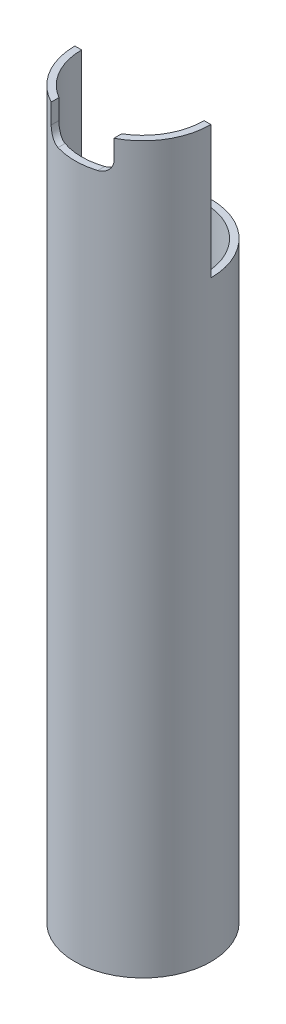
ISO-10303-21;
HEADER;
FILE_DESCRIPTION(('STEP AP214'),'2;1');
FILE_NAME('part.step','',(''),(''),'','','');
FILE_SCHEMA(('AUTOMOTIVE_DESIGN { 1 0 10303 214 1 1 1 1 }'));
ENDSEC;
DATA;
#1=APPLICATION_CONTEXT('core data for automotive mechanical design processes');
#2=APPLICATION_PROTOCOL_DEFINITION('international standard','automotive_design',2000,#1);
#3=PRODUCT_CONTEXT('',#1,'mechanical');
#4=PRODUCT('Part','Part','',(#3));
#5=PRODUCT_RELATED_PRODUCT_CATEGORY('part','',(#4));
#6=PRODUCT_DEFINITION_FORMATION('','',#4);
#7=PRODUCT_DEFINITION_CONTEXT('part definition',#1,'design');
#8=PRODUCT_DEFINITION('design','',#6,#7);
#9=PRODUCT_DEFINITION_SHAPE('','',#8);
#10=(LENGTH_UNIT() NAMED_UNIT(*) SI_UNIT(.MILLI.,.METRE.));
#11=(NAMED_UNIT(*) PLANE_ANGLE_UNIT() SI_UNIT($,.RADIAN.));
#12=(NAMED_UNIT(*) SI_UNIT($,.STERADIAN.) SOLID_ANGLE_UNIT());
#13=UNCERTAINTY_MEASURE_WITH_UNIT(LENGTH_MEASURE(1.E-05),#10,'distance_accuracy_value','');
#14=(GEOMETRIC_REPRESENTATION_CONTEXT(3) GLOBAL_UNCERTAINTY_ASSIGNED_CONTEXT((#13)) GLOBAL_UNIT_ASSIGNED_CONTEXT((#10,
#11,#12)) REPRESENTATION_CONTEXT('',''));
#15=CARTESIAN_POINT('',(0.,0.,0.));
#16=DIRECTION('',(0.,0.,1.));
#17=DIRECTION('',(1.,0.,0.));
#18=AXIS2_PLACEMENT_3D('',#15,#16,#17);
#19=CARTESIAN_POINT('',(0.,152.5,0.));
#20=DIRECTION('',(0.,1.,0.));
#21=DIRECTION('',(0.,0.,1.));
#22=AXIS2_PLACEMENT_3D('',#19,#20,#21);
#23=PLANE('',#22);
#24=DIRECTION('',(0.,0.,-1.));
#25=VECTOR('',#24,1.);
#26=CARTESIAN_POINT('',(6.5,152.5,14.5));
#27=LINE('',#26,#25);
#28=CARTESIAN_POINT('',(6.5,152.5,12.5095765815634));
#29=VERTEX_POINT('',#28);
#30=CARTESIAN_POINT('',(6.5,152.5,10.9105453575887));
#31=VERTEX_POINT('',#30);
#32=EDGE_CURVE('E118',#29,#31,#27,.T.);
#33=ORIENTED_EDGE('',*,*,#32,.F.);
#34=CARTESIAN_POINT('',(0.,152.5,0.));
#35=DIRECTION('',(0.,1.,0.));
#36=DIRECTION('',(0.,0.,1.));
#37=AXIS2_PLACEMENT_3D('',#34,#35,#36);
#38=CIRCLE('',#37,14.0975);
#39=CARTESIAN_POINT('',(14.0975,152.5,0.));
#40=VERTEX_POINT('',#39);
#41=EDGE_CURVE('E130',#29,#40,#38,.T.);
#42=ORIENTED_EDGE('',*,*,#41,.T.);
#43=DIRECTION('',(1.,0.,0.));
#44=VECTOR('',#43,1.);
#45=CARTESIAN_POINT('',(-14.0975,152.5,0.));
#46=LINE('',#45,#44);
#47=CARTESIAN_POINT('',(12.7,152.5,0.));
#48=VERTEX_POINT('',#47);
#49=EDGE_CURVE('E124',#48,#40,#46,.T.);
#50=ORIENTED_EDGE('',*,*,#49,.F.);
#51=CARTESIAN_POINT('',(0.,152.5,0.));
#52=DIRECTION('',(0.,1.,0.));
#53=DIRECTION('',(0.,0.,1.));
#54=AXIS2_PLACEMENT_3D('',#51,#52,#53);
#55=CIRCLE('',#54,12.7);
#56=EDGE_CURVE('E132',#31,#48,#55,.T.);
#57=ORIENTED_EDGE('',*,*,#56,.F.);
#58=EDGE_LOOP('',(#33,#42,#50,#57));
#59=FACE_BOUND('',#58,.T.);
#60=ADVANCED_FACE('F38',(#59),#23,.T.);
#61=DIRECTION('',(0.,0.,1.));
#62=VECTOR('',#61,1.);
#63=CARTESIAN_POINT('',(-6.5,152.5,9.24682981584995));
#64=LINE('',#63,#62);
#65=CARTESIAN_POINT('',(-6.5,152.5,10.9105453575887));
#66=VERTEX_POINT('',#65);
#67=CARTESIAN_POINT('',(-6.5,152.5,12.5095765815634));
#68=VERTEX_POINT('',#67);
#69=EDGE_CURVE('E133',#66,#68,#64,.T.);
#70=ORIENTED_EDGE('',*,*,#69,.F.);
#71=CARTESIAN_POINT('',(-12.7,152.5,0.));
#72=VERTEX_POINT('',#71);
#73=EDGE_CURVE('E141',#72,#66,#55,.T.);
#74=ORIENTED_EDGE('',*,*,#73,.F.);
#75=CARTESIAN_POINT('',(-14.0975,152.5,0.));
#76=VERTEX_POINT('',#75);
#77=EDGE_CURVE('E326',#76,#72,#46,.T.);
#78=ORIENTED_EDGE('',*,*,#77,.F.);
#79=EDGE_CURVE('E140',#76,#68,#38,.T.);
#80=ORIENTED_EDGE('',*,*,#79,.T.);
#81=EDGE_LOOP('',(#70,#74,#78,#80));
#82=FACE_BOUND('',#81,.T.);
#83=ADVANCED_FACE('F193',(#82),#23,.T.);
#84=CARTESIAN_POINT('',(0.,152.5,0.));
#85=DIRECTION('',(0.,-1.,0.));
#86=DIRECTION('',(0.,0.,-1.));
#87=AXIS2_PLACEMENT_3D('',#84,#85,#86);
#88=CYLINDRICAL_SURFACE('',#87,14.0975);
#89=CARTESIAN_POINT('',(0.,2.25,0.));
#90=DIRECTION('',(0.,1.,0.));
#91=DIRECTION('',(0.,0.,1.));
#92=AXIS2_PLACEMENT_3D('',#89,#90,#91);
#93=CIRCLE('',#92,14.0975);
#94=CARTESIAN_POINT('',(0.,2.25,14.0975));
#95=VERTEX_POINT('',#94);
#96=EDGE_CURVE('E134',#95,#95,#93,.T.);
#97=ORIENTED_EDGE('',*,*,#96,.T.);
#98=EDGE_LOOP('',(#97));
#99=FACE_BOUND('',#98,.T.);
#100=ORIENTED_EDGE('',*,*,#41,.F.);
#101=DIRECTION('',(0.,-1.,0.));
#102=VECTOR('',#101,1.);
#103=CARTESIAN_POINT('',(6.5,152.5,12.5095765815634));
#104=LINE('',#103,#102);
#105=CARTESIAN_POINT('',(6.5,148.38,12.5095765815634));
#106=VERTEX_POINT('',#105);
#107=EDGE_CURVE('E114',#29,#106,#104,.T.);
#108=ORIENTED_EDGE('',*,*,#107,.T.);
#109=CARTESIAN_POINT('',(6.5,148.38,12.5095765815634));
#110=CARTESIAN_POINT('',(6.50001009768532,148.317870582901,12.5095676157561));
#111=CARTESIAN_POINT('',(6.49756745840708,148.255747793033,12.5108404474495));
#112=CARTESIAN_POINT('',(6.48785475137029,148.132004895739,12.5158819716807));
#113=CARTESIAN_POINT('',(6.48058645726819,148.070384612039,12.5196497472072));
#114=CARTESIAN_POINT('',(6.4613416872934,147.948351752285,12.5295921766398));
#115=CARTESIAN_POINT('',(6.44938551255921,147.887935133607,12.5357564514063));
#116=CARTESIAN_POINT('',(6.42091702848224,147.768480533861,12.5503619710676));
#117=CARTESIAN_POINT('',(6.40440447344429,147.709442627323,12.5588033387502));
#118=CARTESIAN_POINT('',(6.34832580909172,147.535123129009,12.5872967714154));
#119=CARTESIAN_POINT('',(6.30218014659227,147.422396034739,12.6105385541581));
#120=CARTESIAN_POINT('',(6.19413871822813,147.206559667615,12.6639553040812));
#121=CARTESIAN_POINT('',(6.13222857364848,147.103459293212,12.694136598308));
#122=CARTESIAN_POINT('',(5.99078271491314,146.903385072729,12.76152364721));
#123=CARTESIAN_POINT('',(5.91045986638343,146.807068193437,12.799026161601));
#124=CARTESIAN_POINT('',(5.73668892030619,146.62893764884,12.8778496253));
#125=CARTESIAN_POINT('',(5.64323536941319,146.547130041517,12.9191721586582));
#126=CARTESIAN_POINT('',(5.4354708684361,146.391941064971,13.0080414020841));
#127=CARTESIAN_POINT('',(5.32000901367429,146.320216988342,13.0557975842956));
#128=CARTESIAN_POINT('',(5.07869839158688,146.197427257401,13.1515469838148));
#129=CARTESIAN_POINT('',(4.95285141701944,146.146358046433,13.1995401588718));
#130=CARTESIAN_POINT('',(4.71024316315184,146.071318527466,13.2878711403678));
#131=CARTESIAN_POINT('',(4.59435883536814,146.044729706664,13.3284068887391));
#132=CARTESIAN_POINT('',(4.35918364489443,146.009055558971,13.4071892712809));
#133=CARTESIAN_POINT('',(4.23989290121461,145.999969621339,13.4454359852793));
#134=CARTESIAN_POINT('',(4.12,146.,13.4820290108722));
#135=B_SPLINE_CURVE_WITH_KNOTS('',3,(#109,#110,#111,#112,#113,#114,#115,#116,#117,#118,#119,
#120,#121,#122,#123,#124,#125,#126,#127,#128,#129,#130,#131,#132,#133,#134),.UNSPECIFIED.,.F.,
.F.,(4,2,2,2,2,2,2,2,2,2,2,2,4),(0.,0.186316167403782,0.372563892683267,0.558013814879485,
0.743473739107301,1.11367187593743,1.48420888596078,1.87529740180559,2.26654882437739,
2.69687158394826,3.1271202127177,3.50270754482531,3.87828177102743),.UNSPECIFIED.);
#136=CARTESIAN_POINT('',(4.12,146.,13.4820290108722));
#137=VERTEX_POINT('',#136);
#138=EDGE_CURVE('E177',#106,#137,#135,.T.);
#139=ORIENTED_EDGE('',*,*,#138,.T.);
#140=CARTESIAN_POINT('',(0.,146.,0.));
#141=DIRECTION('',(0.,1.,0.));
#142=DIRECTION('',(0.,0.,1.));
#143=AXIS2_PLACEMENT_3D('',#140,#141,#142);
#144=CIRCLE('',#143,14.0975);
#145=CARTESIAN_POINT('',(-4.12,146.,13.4820290108722));
#146=VERTEX_POINT('',#145);
#147=EDGE_CURVE('E318',#146,#137,#144,.T.);
#148=ORIENTED_EDGE('',*,*,#147,.F.);
#149=CARTESIAN_POINT('',(-4.12,146.,13.4820290108722));
#150=CARTESIAN_POINT('',(-4.19098474362919,146.000001630097,13.4603401242525));
#151=CARTESIAN_POINT('',(-4.26175550893282,146.003176986293,13.43809598906));
#152=CARTESIAN_POINT('',(-4.40241862042576,146.015760231356,13.3926720145503));
#153=CARTESIAN_POINT('',(-4.4723111852089,146.025166536649,13.3694924143834));
#154=CARTESIAN_POINT('',(-4.67977880225313,146.062513170882,13.2988878603086));
#155=CARTESIAN_POINT('',(-4.81542541699703,146.099582165899,13.2503108008415));
#156=CARTESIAN_POINT('',(-5.07762542996818,146.196672448058,13.1520673096199));
#157=CARTESIAN_POINT('',(-5.20418322810617,146.256682539188,13.1024014203781));
#158=CARTESIAN_POINT('',(-5.44522148559835,146.398153769546,13.0040767843277));
#159=CARTESIAN_POINT('',(-5.55969765330369,146.479622495648,12.9554184003068));
#160=CARTESIAN_POINT('',(-5.77472690232289,146.663453443958,12.8610268930136));
#161=CARTESIAN_POINT('',(-5.87508713022025,146.766065147209,12.815338167405));
#162=CARTESIAN_POINT('',(-6.05677869013967,146.98931727874,12.730475640323));
#163=CARTESIAN_POINT('',(-6.138113214441,147.109954676955,12.6913007462283));
#164=CARTESIAN_POINT('',(-6.27414457859427,147.358769404756,12.6245815549173));
#165=CARTESIAN_POINT('',(-6.33012804960091,147.486084322373,12.5964881880794));
#166=CARTESIAN_POINT('',(-6.39701080842967,147.683948742198,12.56257810345));
#167=CARTESIAN_POINT('',(-6.41645162227142,147.751021857872,12.5526489096419));
#168=CARTESIAN_POINT('',(-6.44941808495981,147.886957882047,12.5357432603606));
#169=CARTESIAN_POINT('',(-6.46294708900643,147.955819751781,12.5287651301077));
#170=CARTESIAN_POINT('',(-6.48224741726817,148.083857821893,12.5187889666242));
#171=CARTESIAN_POINT('',(-6.48889990962685,148.14286845675,12.5153397499963));
#172=CARTESIAN_POINT('',(-6.49777766266929,148.261249525318,12.5107312695137));
#173=CARTESIAN_POINT('',(-6.50000742175652,148.320619531776,12.5095696789016));
#174=CARTESIAN_POINT('',(-6.5,148.38,12.5095765815634));
#175=B_SPLINE_CURVE_WITH_KNOTS('',3,(#149,#150,#151,#152,#153,#154,#155,#156,#157,#158,#159,
#160,#161,#162,#163,#164,#165,#166,#167,#168,#169,#170,#171,#172,#173,#174),.UNSPECIFIED.,.F.,
.F.,(4,2,2,2,2,2,2,2,2,2,2,2,4),(0.,0.222522638362844,0.444988745086888,0.889048669323842,
1.3328921537457,1.77689277376118,2.22646793825014,2.67596761535688,3.09899602831486,
3.31032830259547,3.52154048067487,3.69979089919715,3.8778599243901),.UNSPECIFIED.);
#176=CARTESIAN_POINT('',(-6.5,148.38,12.5095765815634));
#177=VERTEX_POINT('',#176);
#178=EDGE_CURVE('E48',#146,#177,#175,.T.);
#179=ORIENTED_EDGE('',*,*,#178,.T.);
#180=DIRECTION('',(0.,-1.,0.));
#181=VECTOR('',#180,1.);
#182=CARTESIAN_POINT('',(-6.5,152.5,12.5095765815634));
#183=LINE('',#182,#181);
#184=EDGE_CURVE('E125',#177,#68,#183,.F.);
#185=ORIENTED_EDGE('',*,*,#184,.T.);
#186=ORIENTED_EDGE('',*,*,#79,.F.);
#187=DIRECTION('',(0.,1.,0.));
#188=VECTOR('',#187,1.);
#189=CARTESIAN_POINT('',(-14.0975,125.,0.));
#190=LINE('',#189,#188);
#191=CARTESIAN_POINT('',(-14.0975,125.,0.));
#192=VERTEX_POINT('',#191);
#193=EDGE_CURVE('E324',#192,#76,#190,.T.);
#194=ORIENTED_EDGE('',*,*,#193,.F.);
#195=CARTESIAN_POINT('',(0.,125.,0.));
#196=DIRECTION('',(0.,-1.,0.));
#197=DIRECTION('',(0.,0.,-1.));
#198=AXIS2_PLACEMENT_3D('',#195,#196,#197);
#199=CIRCLE('',#198,14.0975);
#200=CARTESIAN_POINT('',(14.0975,125.,0.));
#201=VERTEX_POINT('',#200);
#202=EDGE_CURVE('E329',#192,#201,#199,.T.);
#203=ORIENTED_EDGE('',*,*,#202,.T.);
#204=DIRECTION('',(0.,-1.,0.));
#205=VECTOR('',#204,1.);
#206=CARTESIAN_POINT('',(14.0975,152.5,0.));
#207=LINE('',#206,#205);
#208=EDGE_CURVE('E139',#201,#40,#207,.F.);
#209=ORIENTED_EDGE('',*,*,#208,.T.);
#210=EDGE_LOOP('',(#100,#108,#139,#148,#179,#185,#186,#194,#203,#209));
#211=FACE_BOUND('',#210,.T.);
#212=ADVANCED_FACE('F137',(#99,#211),#88,.T.);
#213=CARTESIAN_POINT('',(0.,152.5,0.));
#214=DIRECTION('',(0.,-1.,0.));
#215=DIRECTION('',(0.,0.,-1.));
#216=AXIS2_PLACEMENT_3D('',#213,#214,#215);
#217=CYLINDRICAL_SURFACE('',#216,12.7);
#218=CARTESIAN_POINT('',(0.,2.25,0.));
#219=DIRECTION('',(0.,1.,0.));
#220=DIRECTION('',(0.,0.,1.));
#221=AXIS2_PLACEMENT_3D('',#218,#219,#220);
#222=CIRCLE('',#221,12.7);
#223=CARTESIAN_POINT('',(0.,2.25,12.7));
#224=VERTEX_POINT('',#223);
#225=EDGE_CURVE('E43',#224,#224,#222,.T.);
#226=ORIENTED_EDGE('',*,*,#225,.F.);
#227=EDGE_LOOP('',(#226));
#228=FACE_BOUND('',#227,.T.);
#229=DIRECTION('',(0.,-1.,0.));
#230=VECTOR('',#229,1.);
#231=CARTESIAN_POINT('',(6.5,152.5,10.9105453575887));
#232=LINE('',#231,#230);
#233=CARTESIAN_POINT('',(6.5,148.38,10.9105453575887));
#234=VERTEX_POINT('',#233);
#235=EDGE_CURVE('E161',#31,#234,#232,.T.);
#236=ORIENTED_EDGE('',*,*,#235,.F.);
#237=ORIENTED_EDGE('',*,*,#56,.T.);
#238=DIRECTION('',(0.,-1.,0.));
#239=VECTOR('',#238,1.);
#240=CARTESIAN_POINT('',(12.7,152.5,0.));
#241=LINE('',#240,#239);
#242=CARTESIAN_POINT('',(12.7,125.,0.));
#243=VERTEX_POINT('',#242);
#244=EDGE_CURVE('E150',#243,#48,#241,.F.);
#245=ORIENTED_EDGE('',*,*,#244,.F.);
#246=CARTESIAN_POINT('',(0.,125.,0.));
#247=DIRECTION('',(0.,-1.,0.));
#248=DIRECTION('',(0.,0.,-1.));
#249=AXIS2_PLACEMENT_3D('',#246,#247,#248);
#250=CIRCLE('',#249,12.7);
#251=CARTESIAN_POINT('',(-12.7,125.,0.));
#252=VERTEX_POINT('',#251);
#253=EDGE_CURVE('E144',#252,#243,#250,.T.);
#254=ORIENTED_EDGE('',*,*,#253,.F.);
#255=DIRECTION('',(0.,-1.,0.));
#256=VECTOR('',#255,1.);
#257=CARTESIAN_POINT('',(-12.7,152.5,0.));
#258=LINE('',#257,#256);
#259=EDGE_CURVE('E153',#72,#252,#258,.T.);
#260=ORIENTED_EDGE('',*,*,#259,.F.);
#261=ORIENTED_EDGE('',*,*,#73,.T.);
#262=DIRECTION('',(0.,-1.,0.));
#263=VECTOR('',#262,1.);
#264=CARTESIAN_POINT('',(-6.5,152.5,10.9105453575887));
#265=LINE('',#264,#263);
#266=CARTESIAN_POINT('',(-6.5,148.38,10.9105453575887));
#267=VERTEX_POINT('',#266);
#268=EDGE_CURVE('E159',#267,#66,#265,.F.);
#269=ORIENTED_EDGE('',*,*,#268,.F.);
#270=CARTESIAN_POINT('',(-6.5,148.38,10.9105453575887));
#271=CARTESIAN_POINT('',(-6.50001088735296,148.319043760554,10.9105346732622));
#272=CARTESIAN_POINT('',(-6.49765852130349,148.258095159801,10.9119402075039));
#273=CARTESIAN_POINT('',(-6.48831152221107,148.136708510344,10.9175028005306));
#274=CARTESIAN_POINT('',(-6.48131901454447,148.076270240716,10.9216585995785));
#275=CARTESIAN_POINT('',(-6.46282323225552,147.956649437679,10.9326128722715));
#276=CARTESIAN_POINT('',(-6.45134320193654,147.897462064,10.9393977264795));
#277=CARTESIAN_POINT('',(-6.42403198127844,147.780458035256,10.9554581510253));
#278=CARTESIAN_POINT('',(-6.40820047191953,147.722641481028,10.9647339039771));
#279=CARTESIAN_POINT('',(-6.35450011048327,147.552002144147,10.9960018571569));
#280=CARTESIAN_POINT('',(-6.31038023962045,147.441704151166,11.0214621501823));
#281=CARTESIAN_POINT('',(-6.20728053204836,147.23042170825,11.0798538459556));
#282=CARTESIAN_POINT('',(-6.14828340259125,147.129448284732,11.1127939384667));
#283=CARTESIAN_POINT('',(-6.0128695401625,146.931992768285,11.1866765249768));
#284=CARTESIAN_POINT('',(-5.93554048289315,146.836284139853,11.2280110899305));
#285=CARTESIAN_POINT('',(-5.76827539690865,146.658814702578,11.3148523905307));
#286=CARTESIAN_POINT('',(-5.67833389438963,146.577059984074,11.3603609347027));
#287=CARTESIAN_POINT('',(-5.47572761633155,146.419155008177,11.4595226262541));
#288=CARTESIAN_POINT('',(-5.36162762858543,146.345029158018,11.5134769036124));
#289=CARTESIAN_POINT('',(-5.12268643174607,146.217274520086,11.6217593971051));
#290=CARTESIAN_POINT('',(-4.99784596107197,146.163644324593,11.6760875872967));
#291=CARTESIAN_POINT('',(-4.74933591680528,146.081258862228,11.7792433134654));
#292=CARTESIAN_POINT('',(-4.62621539059357,146.051004849001,11.828187143887));
#293=CARTESIAN_POINT('',(-4.43835400541163,146.020532260752,11.8993919079599));
#294=CARTESIAN_POINT('',(-4.37517174504096,146.012859370079,11.9227692305159));
#295=CARTESIAN_POINT('',(-4.24806205454295,146.002593037803,11.968648451232));
#296=CARTESIAN_POINT('',(-4.1841344233686,146.000001000095,11.9911501057527));
#297=CARTESIAN_POINT('',(-4.12,146.,12.0131428027806));
#298=B_SPLINE_CURVE_WITH_KNOTS('',3,(#270,#271,#272,#273,#274,#275,#276,#277,#278,#279,#280,
#281,#282,#283,#284,#285,#286,#287,#288,#289,#290,#291,#292,#293,#294,#295,#296,#297),
.UNSPECIFIED.,.F.,.F.,(4,2,2,2,2,2,2,2,2,2,2,2,2,4),(0.,0.182794514069929,0.36550535844777,
0.547282084081665,0.729072139860438,1.09179218924702,1.45493580955165,1.84279616195918,
2.23082536983475,2.66804621378961,3.10523702235064,3.51131185337635,3.71454828246224,
3.91784086006427),.UNSPECIFIED.);
#299=CARTESIAN_POINT('',(-4.12,146.,12.0131428027806));
#300=VERTEX_POINT('',#299);
#301=EDGE_CURVE('E11',#267,#300,#298,.T.);
#302=ORIENTED_EDGE('',*,*,#301,.T.);
#303=CARTESIAN_POINT('',(0.,146.,0.));
#304=DIRECTION('',(0.,1.,0.));
#305=DIRECTION('',(0.,0.,1.));
#306=AXIS2_PLACEMENT_3D('',#303,#304,#305);
#307=CIRCLE('',#306,12.7);
#308=CARTESIAN_POINT('',(4.12,146.,12.0131428027806));
#309=VERTEX_POINT('',#308);
#310=EDGE_CURVE('E156',#300,#309,#307,.T.);
#311=ORIENTED_EDGE('',*,*,#310,.T.);
#312=CARTESIAN_POINT('',(4.12,146.,12.0131428027806));
#313=CARTESIAN_POINT('',(4.19200650797641,146.000001992391,11.9884517381874));
#314=CARTESIAN_POINT('',(4.26374526629335,146.003268899882,11.9631198948691));
#315=CARTESIAN_POINT('',(4.40622742887299,146.016190679507,11.9113764029583));
#316=CARTESIAN_POINT('',(4.47697113811723,146.02584354877,11.8849650953613));
#317=CARTESIAN_POINT('',(4.68678595808487,146.064116475585,11.8045063311336));
#318=CARTESIAN_POINT('',(4.82375494147644,146.102052132617,11.7491259098461));
#319=CARTESIAN_POINT('',(5.08815201578518,146.201230792339,11.637068744069));
#320=CARTESIAN_POINT('',(5.21558732337438,146.2624559476,11.5803930233876));
#321=CARTESIAN_POINT('',(5.45810497472878,146.406732175295,11.468083991914));
#322=CARTESIAN_POINT('',(5.5731802981534,146.48979556024,11.4124512881965));
#323=CARTESIAN_POINT('',(5.7897028299144,146.677822626916,11.304170203067));
#324=CARTESIAN_POINT('',(5.89087351361473,146.783147122716,11.2515918649023));
#325=CARTESIAN_POINT('',(6.07358437972288,147.012731860152,11.1540267899921));
#326=CARTESIAN_POINT('',(6.15513036367859,147.136986487791,11.109037810823));
#327=CARTESIAN_POINT('',(6.28951469812377,147.391714805662,11.0334741496124));
#328=CARTESIAN_POINT('',(6.34403852592874,147.521036488304,11.0020756009466));
#329=CARTESIAN_POINT('',(6.40834223266653,147.722080424258,10.9646590764695));
#330=CARTESIAN_POINT('',(6.42685678868543,147.790225586174,10.9538043520165));
#331=CARTESIAN_POINT('',(6.45781509846172,147.928322024726,10.9355818970137));
#332=CARTESIAN_POINT('',(6.47026300175169,147.998272032285,10.9282117831269));
#333=CARTESIAN_POINT('',(6.4863560412479,148.120268785242,10.9186651337176));
#334=CARTESIAN_POINT('',(6.49146929522417,148.172061236432,10.9156242999898));
#335=CARTESIAN_POINT('',(6.49829187478314,148.275898987933,10.9115629848687));
#336=CARTESIAN_POINT('',(6.50000441333593,148.327944002963,10.9105405964688));
#337=CARTESIAN_POINT('',(6.5,148.38,10.9105453575887));
#338=B_SPLINE_CURVE_WITH_KNOTS('',3,(#312,#313,#314,#315,#316,#317,#318,#319,#320,#321,#322,
#323,#324,#325,#326,#327,#328,#329,#330,#331,#332,#333,#334,#335,#336,#337),.UNSPECIFIED.,.F.,
.F.,(4,2,2,2,2,2,2,2,2,2,2,2,4),(0.,0.228208752075058,0.456345963423635,0.911636564751323,
1.36657896406082,1.82177841439823,2.28501573347573,2.74811593942735,3.17673309897565,
3.39076479888318,3.60464989697072,3.76090660953327,3.91701562156823),.UNSPECIFIED.);
#339=EDGE_CURVE('E171',#309,#234,#338,.T.);
#340=ORIENTED_EDGE('',*,*,#339,.T.);
#341=EDGE_LOOP('',(#236,#237,#245,#254,#260,#261,#269,#302,#311,#340));
#342=FACE_BOUND('',#341,.T.);
#343=ADVANCED_FACE('F185',(#228,#342),#217,.F.);
#344=CARTESIAN_POINT('',(-14.0975,125.,0.));
#345=DIRECTION('',(0.,0.,1.));
#346=DIRECTION('',(1.,0.,0.));
#347=AXIS2_PLACEMENT_3D('',#344,#345,#346);
#348=PLANE('',#347);
#349=DIRECTION('',(1.,0.,0.));
#350=VECTOR('',#349,1.);
#351=CARTESIAN_POINT('',(-14.0975,125.,0.));
#352=LINE('',#351,#350);
#353=EDGE_CURVE('E325',#243,#201,#352,.T.);
#354=ORIENTED_EDGE('',*,*,#353,.F.);
#355=ORIENTED_EDGE('',*,*,#244,.T.);
#356=ORIENTED_EDGE('',*,*,#49,.T.);
#357=ORIENTED_EDGE('',*,*,#208,.F.);
#358=EDGE_LOOP('',(#354,#355,#356,#357));
#359=FACE_BOUND('',#358,.T.);
#360=ADVANCED_FACE('F190',(#359),#348,.F.);
#361=ORIENTED_EDGE('',*,*,#259,.T.);
#362=EDGE_CURVE('E322',#192,#252,#352,.T.);
#363=ORIENTED_EDGE('',*,*,#362,.F.);
#364=ORIENTED_EDGE('',*,*,#193,.T.);
#365=ORIENTED_EDGE('',*,*,#77,.T.);
#366=EDGE_LOOP('',(#361,#363,#364,#365));
#367=FACE_BOUND('',#366,.T.);
#368=ADVANCED_FACE('F238',(#367),#348,.F.);
#369=CARTESIAN_POINT('',(0.,125.,0.));
#370=DIRECTION('',(0.,-1.,0.));
#371=DIRECTION('',(0.,0.,-1.));
#372=AXIS2_PLACEMENT_3D('',#369,#370,#371);
#373=PLANE('',#372);
#374=ORIENTED_EDGE('',*,*,#362,.T.);
#375=ORIENTED_EDGE('',*,*,#253,.T.);
#376=ORIENTED_EDGE('',*,*,#353,.T.);
#377=ORIENTED_EDGE('',*,*,#202,.F.);
#378=EDGE_LOOP('',(#374,#375,#376,#377));
#379=FACE_BOUND('',#378,.T.);
#380=ADVANCED_FACE('F244',(#379),#373,.F.);
#381=CARTESIAN_POINT('',(6.5,146.,14.5));
#382=DIRECTION('',(1.,0.,0.));
#383=DIRECTION('',(0.,0.,-1.));
#384=AXIS2_PLACEMENT_3D('',#381,#382,#383);
#385=PLANE('',#384);
#386=ORIENTED_EDGE('',*,*,#235,.T.);
#387=DIRECTION('',(0.,0.,-1.));
#388=VECTOR('',#387,1.);
#389=CARTESIAN_POINT('',(6.5,148.38,14.5));
#390=LINE('',#389,#388);
#391=EDGE_CURVE('E121',#234,#106,#390,.F.);
#392=ORIENTED_EDGE('',*,*,#391,.T.);
#393=ORIENTED_EDGE('',*,*,#107,.F.);
#394=ORIENTED_EDGE('',*,*,#32,.T.);
#395=EDGE_LOOP('',(#386,#392,#393,#394));
#396=FACE_BOUND('',#395,.T.);
#397=ADVANCED_FACE('F117',(#396),#385,.F.);
#398=CARTESIAN_POINT('',(-6.5,146.,9.24682981584995));
#399=DIRECTION('',(-1.,0.,0.));
#400=DIRECTION('',(0.,0.,1.));
#401=AXIS2_PLACEMENT_3D('',#398,#399,#400);
#402=PLANE('',#401);
#403=ORIENTED_EDGE('',*,*,#184,.F.);
#404=DIRECTION('',(0.,0.,1.));
#405=VECTOR('',#404,1.);
#406=CARTESIAN_POINT('',(-6.5,148.38,9.24682981584995));
#407=LINE('',#406,#405);
#408=EDGE_CURVE('E61',#177,#267,#407,.F.);
#409=ORIENTED_EDGE('',*,*,#408,.T.);
#410=ORIENTED_EDGE('',*,*,#268,.T.);
#411=ORIENTED_EDGE('',*,*,#69,.T.);
#412=EDGE_LOOP('',(#403,#409,#410,#411));
#413=FACE_BOUND('',#412,.T.);
#414=ADVANCED_FACE('F255',(#413),#402,.F.);
#415=CARTESIAN_POINT('',(0.,146.,0.));
#416=DIRECTION('',(0.,1.,0.));
#417=DIRECTION('',(0.,0.,1.));
#418=AXIS2_PLACEMENT_3D('',#415,#416,#417);
#419=PLANE('',#418);
#420=ORIENTED_EDGE('',*,*,#147,.T.);
#421=DIRECTION('',(0.,0.,-1.));
#422=VECTOR('',#421,1.);
#423=CARTESIAN_POINT('',(4.12,146.,0.));
#424=LINE('',#423,#422);
#425=EDGE_CURVE('E166',#137,#309,#424,.T.);
#426=ORIENTED_EDGE('',*,*,#425,.T.);
#427=ORIENTED_EDGE('',*,*,#310,.F.);
#428=DIRECTION('',(0.,0.,1.));
#429=VECTOR('',#428,1.);
#430=CARTESIAN_POINT('',(-4.12,146.,0.));
#431=LINE('',#430,#429);
#432=EDGE_CURVE('E163',#300,#146,#431,.T.);
#433=ORIENTED_EDGE('',*,*,#432,.T.);
#434=EDGE_LOOP('',(#420,#426,#427,#433));
#435=FACE_BOUND('',#434,.T.);
#436=ADVANCED_FACE('F262',(#435),#419,.T.);
#437=CARTESIAN_POINT('',(4.12,148.38,0.));
#438=DIRECTION('',(0.,0.,-1.));
#439=DIRECTION('',(-1.,0.,0.));
#440=AXIS2_PLACEMENT_3D('',#437,#438,#439);
#441=CYLINDRICAL_SURFACE('',#440,2.38);
#442=ORIENTED_EDGE('',*,*,#138,.F.);
#443=ORIENTED_EDGE('',*,*,#391,.F.);
#444=ORIENTED_EDGE('',*,*,#339,.F.);
#445=ORIENTED_EDGE('',*,*,#425,.F.);
#446=EDGE_LOOP('',(#442,#443,#444,#445));
#447=FACE_BOUND('',#446,.T.);
#448=ADVANCED_FACE('F183',(#447),#441,.F.);
#449=CARTESIAN_POINT('',(-4.12,148.38,0.));
#450=DIRECTION('',(0.,0.,1.));
#451=DIRECTION('',(1.,0.,0.));
#452=AXIS2_PLACEMENT_3D('',#449,#450,#451);
#453=CYLINDRICAL_SURFACE('',#452,2.38);
#454=ORIENTED_EDGE('',*,*,#301,.F.);
#455=ORIENTED_EDGE('',*,*,#408,.F.);
#456=ORIENTED_EDGE('',*,*,#178,.F.);
#457=ORIENTED_EDGE('',*,*,#432,.F.);
#458=EDGE_LOOP('',(#454,#455,#456,#457));
#459=FACE_BOUND('',#458,.T.);
#460=ADVANCED_FACE('F40',(#459),#453,.F.);
#461=CARTESIAN_POINT('',(0.,2.25,0.));
#462=DIRECTION('',(0.,1.,0.));
#463=DIRECTION('',(0.,0.,1.));
#464=AXIS2_PLACEMENT_3D('',#461,#462,#463);
#465=PLANE('',#464);
#466=ORIENTED_EDGE('',*,*,#225,.T.);
#467=EDGE_LOOP('',(#466));
#468=FACE_BOUND('',#467,.T.);
#469=ORIENTED_EDGE('',*,*,#96,.F.);
#470=EDGE_LOOP('',(#469));
#471=FACE_BOUND('',#470,.T.);
#472=ADVANCED_FACE('F281',(#468,#471),#465,.F.);
#473=CLOSED_SHELL('',(#60,#83,#212,#343,#360,#368,#380,#397,#414,#436,#448,#460,#472));
#474=MANIFOLD_SOLID_BREP('B2',#473);
#475=ADVANCED_BREP_SHAPE_REPRESENTATION('',(#18,#474),#14);
#476=SHAPE_DEFINITION_REPRESENTATION(#9,#475);
ENDSEC;
END-ISO-10303-21;
